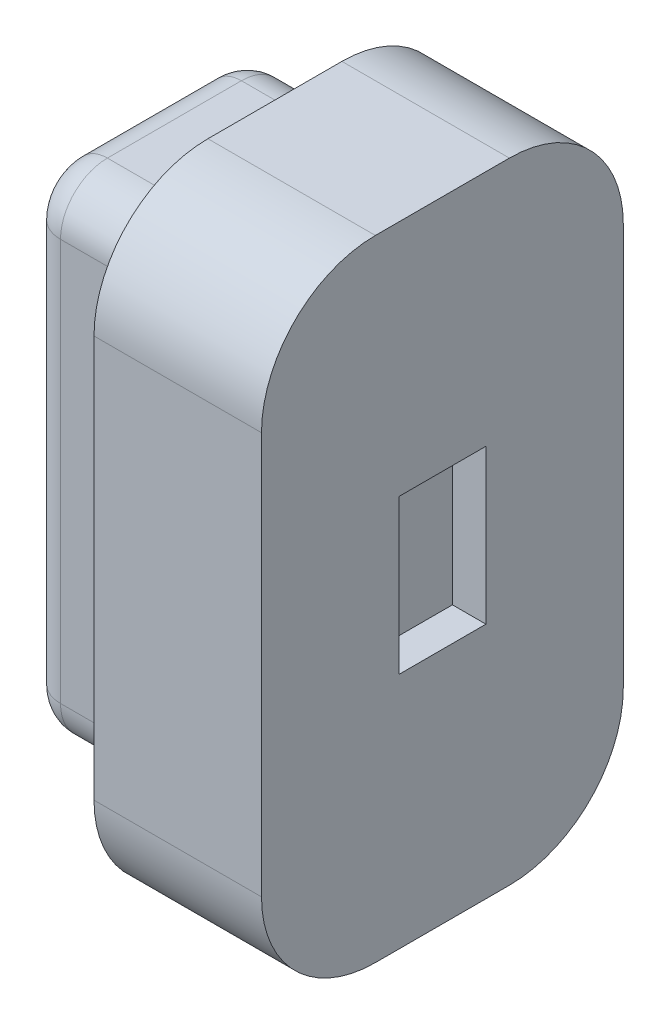
ISO-10303-21;
HEADER;
FILE_DESCRIPTION(('STEP AP214'),'2;1');
FILE_NAME('part.step','',(''),(''),'','','');
FILE_SCHEMA(('AUTOMOTIVE_DESIGN { 1 0 10303 214 1 1 1 1 }'));
ENDSEC;
DATA;
#1=APPLICATION_CONTEXT('core data for automotive mechanical design processes');
#2=APPLICATION_PROTOCOL_DEFINITION('international standard','automotive_design',2000,#1);
#3=PRODUCT_CONTEXT('',#1,'mechanical');
#4=PRODUCT('Part','Part','',(#3));
#5=PRODUCT_RELATED_PRODUCT_CATEGORY('part','',(#4));
#6=PRODUCT_DEFINITION_FORMATION('','',#4);
#7=PRODUCT_DEFINITION_CONTEXT('part definition',#1,'design');
#8=PRODUCT_DEFINITION('design','',#6,#7);
#9=PRODUCT_DEFINITION_SHAPE('','',#8);
#10=(LENGTH_UNIT() NAMED_UNIT(*) SI_UNIT(.MILLI.,.METRE.));
#11=(NAMED_UNIT(*) PLANE_ANGLE_UNIT() SI_UNIT($,.RADIAN.));
#12=(NAMED_UNIT(*) SI_UNIT($,.STERADIAN.) SOLID_ANGLE_UNIT());
#13=UNCERTAINTY_MEASURE_WITH_UNIT(LENGTH_MEASURE(1.E-05),#10,'distance_accuracy_value','');
#14=(GEOMETRIC_REPRESENTATION_CONTEXT(3) GLOBAL_UNCERTAINTY_ASSIGNED_CONTEXT((#13)) GLOBAL_UNIT_ASSIGNED_CONTEXT((#10,
#11,#12)) REPRESENTATION_CONTEXT('',''));
#15=CARTESIAN_POINT('',(0.,0.,0.));
#16=DIRECTION('',(0.,0.,1.));
#17=DIRECTION('',(1.,0.,0.));
#18=AXIS2_PLACEMENT_3D('',#15,#16,#17);
#19=CARTESIAN_POINT('',(-57.5,0.,0.));
#20=DIRECTION('',(-1.,0.,0.));
#21=DIRECTION('',(0.,0.,1.));
#22=AXIS2_PLACEMENT_3D('',#19,#20,#21);
#23=PLANE('',#22);
#24=DIRECTION('',(0.,-1.,0.));
#25=VECTOR('',#24,1.);
#26=CARTESIAN_POINT('',(-57.5,0.,6.4));
#27=LINE('',#26,#25);
#28=CARTESIAN_POINT('',(-57.5,25.08,6.4));
#29=VERTEX_POINT('',#28);
#30=CARTESIAN_POINT('',(-57.5,19.08,6.4));
#31=VERTEX_POINT('',#30);
#32=EDGE_CURVE('E363',#29,#31,#27,.T.);
#33=ORIENTED_EDGE('',*,*,#32,.T.);
#34=CARTESIAN_POINT('',(-57.5,19.08,6.6));
#35=DIRECTION('',(-1.,0.,0.));
#36=DIRECTION('',(0.,0.,1.));
#37=AXIS2_PLACEMENT_3D('',#34,#35,#36);
#38=CIRCLE('',#37,0.2);
#39=CARTESIAN_POINT('',(-57.5,18.88,6.6));
#40=VERTEX_POINT('',#39);
#41=EDGE_CURVE('E365',#31,#40,#38,.T.);
#42=ORIENTED_EDGE('',*,*,#41,.T.);
#43=DIRECTION('',(0.,0.,1.));
#44=VECTOR('',#43,1.);
#45=CARTESIAN_POINT('',(-57.5,18.88,0.));
#46=LINE('',#45,#44);
#47=CARTESIAN_POINT('',(-57.5,18.88,8.6));
#48=VERTEX_POINT('',#47);
#49=EDGE_CURVE('E333',#40,#48,#46,.T.);
#50=ORIENTED_EDGE('',*,*,#49,.T.);
#51=CARTESIAN_POINT('',(-57.5,19.08,8.6));
#52=DIRECTION('',(-1.,0.,0.));
#53=DIRECTION('',(0.,0.,1.));
#54=AXIS2_PLACEMENT_3D('',#51,#52,#53);
#55=CIRCLE('',#54,0.2);
#56=CARTESIAN_POINT('',(-57.5,19.08,8.8));
#57=VERTEX_POINT('',#56);
#58=EDGE_CURVE('E353',#48,#57,#55,.T.);
#59=ORIENTED_EDGE('',*,*,#58,.T.);
#60=DIRECTION('',(0.,1.,0.));
#61=VECTOR('',#60,1.);
#62=CARTESIAN_POINT('',(-57.5,0.,8.8));
#63=LINE('',#62,#61);
#64=CARTESIAN_POINT('',(-57.5,25.08,8.8));
#65=VERTEX_POINT('',#64);
#66=EDGE_CURVE('E355',#57,#65,#63,.T.);
#67=ORIENTED_EDGE('',*,*,#66,.T.);
#68=CARTESIAN_POINT('',(-57.5,25.08,8.6));
#69=DIRECTION('',(-1.,0.,0.));
#70=DIRECTION('',(0.,0.,1.));
#71=AXIS2_PLACEMENT_3D('',#68,#69,#70);
#72=CIRCLE('',#71,0.2);
#73=CARTESIAN_POINT('',(-57.5,25.28,8.6));
#74=VERTEX_POINT('',#73);
#75=EDGE_CURVE('E357',#65,#74,#72,.T.);
#76=ORIENTED_EDGE('',*,*,#75,.T.);
#77=DIRECTION('',(0.,0.,-1.));
#78=VECTOR('',#77,1.);
#79=CARTESIAN_POINT('',(-57.5,25.28,0.));
#80=LINE('',#79,#78);
#81=CARTESIAN_POINT('',(-57.5,25.28,6.6));
#82=VERTEX_POINT('',#81);
#83=EDGE_CURVE('E359',#74,#82,#80,.T.);
#84=ORIENTED_EDGE('',*,*,#83,.T.);
#85=CARTESIAN_POINT('',(-57.5,25.08,6.6));
#86=DIRECTION('',(-1.,0.,0.));
#87=DIRECTION('',(0.,0.,1.));
#88=AXIS2_PLACEMENT_3D('',#85,#86,#87);
#89=CIRCLE('',#88,0.2);
#90=EDGE_CURVE('E361',#82,#29,#89,.T.);
#91=ORIENTED_EDGE('',*,*,#90,.T.);
#92=EDGE_LOOP('',(#33,#42,#50,#59,#67,#76,#84,#91));
#93=FACE_BOUND('',#92,.T.);
#94=ADVANCED_FACE('F45',(#93),#23,.T.);
#95=CARTESIAN_POINT('',(-57.,19.08,8.6));
#96=DIRECTION('',(-1.,0.,0.));
#97=DIRECTION('',(0.,0.,1.));
#98=AXIS2_PLACEMENT_3D('',#95,#96,#97);
#99=DEGENERATE_TOROIDAL_SURFACE('',#98,0.2,0.5,.T.);
#100=CARTESIAN_POINT('',(-57.,19.08,8.8));
#101=DIRECTION('',(0.,-1.,0.));
#102=DIRECTION('',(0.,0.,-1.));
#103=AXIS2_PLACEMENT_3D('',#100,#101,#102);
#104=CIRCLE('',#103,0.5);
#105=CARTESIAN_POINT('',(-57.,19.08,9.3));
#106=VERTEX_POINT('',#105);
#107=EDGE_CURVE('E391',#106,#57,#104,.T.);
#108=ORIENTED_EDGE('',*,*,#107,.T.);
#109=ORIENTED_EDGE('',*,*,#58,.F.);
#110=CARTESIAN_POINT('',(-57.,18.88,8.6));
#111=DIRECTION('',(0.,0.,-1.));
#112=DIRECTION('',(-1.,0.,0.));
#113=AXIS2_PLACEMENT_3D('',#110,#111,#112);
#114=CIRCLE('',#113,0.5);
#115=CARTESIAN_POINT('',(-57.,18.38,8.6));
#116=VERTEX_POINT('',#115);
#117=EDGE_CURVE('E385',#116,#48,#114,.T.);
#118=ORIENTED_EDGE('',*,*,#117,.F.);
#119=CARTESIAN_POINT('',(-57.,19.08,8.6));
#120=DIRECTION('',(-1.,0.,0.));
#121=DIRECTION('',(0.,0.,1.));
#122=AXIS2_PLACEMENT_3D('',#119,#120,#121);
#123=CIRCLE('',#122,0.7);
#124=EDGE_CURVE('E54',#106,#116,#123,.F.);
#125=ORIENTED_EDGE('',*,*,#124,.F.);
#126=EDGE_LOOP('',(#108,#109,#118,#125));
#127=FACE_BOUND('',#126,.T.);
#128=ADVANCED_FACE('F444',(#127),#99,.T.);
#129=CARTESIAN_POINT('',(-57.,0.,8.8));
#130=DIRECTION('',(0.,1.,0.));
#131=DIRECTION('',(0.,0.,1.));
#132=AXIS2_PLACEMENT_3D('',#129,#130,#131);
#133=CYLINDRICAL_SURFACE('',#132,0.5);
#134=CARTESIAN_POINT('',(-57.,25.08,8.8));
#135=DIRECTION('',(0.,-1.,0.));
#136=DIRECTION('',(0.,0.,-1.));
#137=AXIS2_PLACEMENT_3D('',#134,#135,#136);
#138=CIRCLE('',#137,0.5);
#139=CARTESIAN_POINT('',(-57.,25.08,9.3));
#140=VERTEX_POINT('',#139);
#141=EDGE_CURVE('E396',#140,#65,#138,.T.);
#142=ORIENTED_EDGE('',*,*,#141,.T.);
#143=ORIENTED_EDGE('',*,*,#66,.F.);
#144=ORIENTED_EDGE('',*,*,#107,.F.);
#145=DIRECTION('',(0.,1.,0.));
#146=VECTOR('',#145,1.);
#147=CARTESIAN_POINT('',(-57.,0.,9.3));
#148=LINE('',#147,#146);
#149=EDGE_CURVE('E379',#140,#106,#148,.F.);
#150=ORIENTED_EDGE('',*,*,#149,.F.);
#151=EDGE_LOOP('',(#142,#143,#144,#150));
#152=FACE_BOUND('',#151,.T.);
#153=ADVANCED_FACE('F442',(#152),#133,.T.);
#154=CARTESIAN_POINT('',(-57.,25.08,8.6));
#155=DIRECTION('',(-1.,0.,0.));
#156=DIRECTION('',(0.,0.,1.));
#157=AXIS2_PLACEMENT_3D('',#154,#155,#156);
#158=DEGENERATE_TOROIDAL_SURFACE('',#157,0.2,0.5,.T.);
#159=ORIENTED_EDGE('',*,*,#141,.F.);
#160=CARTESIAN_POINT('',(-57.,25.08,8.6));
#161=DIRECTION('',(-1.,0.,0.));
#162=DIRECTION('',(0.,0.,1.));
#163=AXIS2_PLACEMENT_3D('',#160,#161,#162);
#164=CIRCLE('',#163,0.7);
#165=CARTESIAN_POINT('',(-57.,25.78,8.6));
#166=VERTEX_POINT('',#165);
#167=EDGE_CURVE('E377',#166,#140,#164,.F.);
#168=ORIENTED_EDGE('',*,*,#167,.F.);
#169=CARTESIAN_POINT('',(-57.,25.28,8.6));
#170=DIRECTION('',(0.,0.,-1.));
#171=DIRECTION('',(-1.,0.,0.));
#172=AXIS2_PLACEMENT_3D('',#169,#170,#171);
#173=CIRCLE('',#172,0.5);
#174=EDGE_CURVE('E49',#74,#166,#173,.T.);
#175=ORIENTED_EDGE('',*,*,#174,.F.);
#176=ORIENTED_EDGE('',*,*,#75,.F.);
#177=EDGE_LOOP('',(#159,#168,#175,#176));
#178=FACE_BOUND('',#177,.T.);
#179=ADVANCED_FACE('F47',(#178),#158,.T.);
#180=CARTESIAN_POINT('',(-57.,25.28,0.));
#181=DIRECTION('',(0.,0.,-1.));
#182=DIRECTION('',(-1.,0.,0.));
#183=AXIS2_PLACEMENT_3D('',#180,#181,#182);
#184=CYLINDRICAL_SURFACE('',#183,0.5);
#185=ORIENTED_EDGE('',*,*,#174,.T.);
#186=DIRECTION('',(0.,0.,-1.));
#187=VECTOR('',#186,1.);
#188=CARTESIAN_POINT('',(-57.,25.78,0.));
#189=LINE('',#188,#187);
#190=CARTESIAN_POINT('',(-57.,25.78,6.6));
#191=VERTEX_POINT('',#190);
#192=EDGE_CURVE('E375',#191,#166,#189,.F.);
#193=ORIENTED_EDGE('',*,*,#192,.F.);
#194=CARTESIAN_POINT('',(-57.,25.28,6.6));
#195=DIRECTION('',(0.,0.,-1.));
#196=DIRECTION('',(-1.,0.,0.));
#197=AXIS2_PLACEMENT_3D('',#194,#195,#196);
#198=CIRCLE('',#197,0.5);
#199=EDGE_CURVE('E394',#82,#191,#198,.T.);
#200=ORIENTED_EDGE('',*,*,#199,.F.);
#201=ORIENTED_EDGE('',*,*,#83,.F.);
#202=EDGE_LOOP('',(#185,#193,#200,#201));
#203=FACE_BOUND('',#202,.T.);
#204=ADVANCED_FACE('F407',(#203),#184,.T.);
#205=CARTESIAN_POINT('',(-57.,25.08,6.6));
#206=DIRECTION('',(-1.,0.,0.));
#207=DIRECTION('',(0.,0.,1.));
#208=AXIS2_PLACEMENT_3D('',#205,#206,#207);
#209=DEGENERATE_TOROIDAL_SURFACE('',#208,0.2,0.5,.T.);
#210=ORIENTED_EDGE('',*,*,#199,.T.);
#211=CARTESIAN_POINT('',(-57.,25.08,6.6));
#212=DIRECTION('',(-1.,0.,0.));
#213=DIRECTION('',(0.,0.,1.));
#214=AXIS2_PLACEMENT_3D('',#211,#212,#213);
#215=CIRCLE('',#214,0.7);
#216=CARTESIAN_POINT('',(-57.,25.08,5.9));
#217=VERTEX_POINT('',#216);
#218=EDGE_CURVE('E373',#217,#191,#215,.F.);
#219=ORIENTED_EDGE('',*,*,#218,.F.);
#220=CARTESIAN_POINT('',(-57.,25.08,6.4));
#221=DIRECTION('',(0.,-1.,0.));
#222=DIRECTION('',(0.,0.,-1.));
#223=AXIS2_PLACEMENT_3D('',#220,#221,#222);
#224=CIRCLE('',#223,0.5);
#225=EDGE_CURVE('E388',#29,#217,#224,.T.);
#226=ORIENTED_EDGE('',*,*,#225,.F.);
#227=ORIENTED_EDGE('',*,*,#90,.F.);
#228=EDGE_LOOP('',(#210,#219,#226,#227));
#229=FACE_BOUND('',#228,.T.);
#230=ADVANCED_FACE('F431',(#229),#209,.T.);
#231=CARTESIAN_POINT('',(-57.,0.,6.4));
#232=DIRECTION('',(0.,-1.,0.));
#233=DIRECTION('',(0.,0.,-1.));
#234=AXIS2_PLACEMENT_3D('',#231,#232,#233);
#235=CYLINDRICAL_SURFACE('',#234,0.5);
#236=ORIENTED_EDGE('',*,*,#225,.T.);
#237=DIRECTION('',(0.,-1.,0.));
#238=VECTOR('',#237,1.);
#239=CARTESIAN_POINT('',(-57.,0.,5.9));
#240=LINE('',#239,#238);
#241=CARTESIAN_POINT('',(-57.,19.08,5.9));
#242=VERTEX_POINT('',#241);
#243=EDGE_CURVE('E371',#242,#217,#240,.F.);
#244=ORIENTED_EDGE('',*,*,#243,.F.);
#245=CARTESIAN_POINT('',(-57.,19.08,6.4));
#246=DIRECTION('',(0.,-1.,0.));
#247=DIRECTION('',(0.,0.,-1.));
#248=AXIS2_PLACEMENT_3D('',#245,#246,#247);
#249=CIRCLE('',#248,0.5);
#250=EDGE_CURVE('E383',#31,#242,#249,.T.);
#251=ORIENTED_EDGE('',*,*,#250,.F.);
#252=ORIENTED_EDGE('',*,*,#32,.F.);
#253=EDGE_LOOP('',(#236,#244,#251,#252));
#254=FACE_BOUND('',#253,.T.);
#255=ADVANCED_FACE('F436',(#254),#235,.T.);
#256=CARTESIAN_POINT('',(-57.,19.08,6.6));
#257=DIRECTION('',(-1.,0.,0.));
#258=DIRECTION('',(0.,0.,1.));
#259=AXIS2_PLACEMENT_3D('',#256,#257,#258);
#260=DEGENERATE_TOROIDAL_SURFACE('',#259,0.2,0.5,.T.);
#261=ORIENTED_EDGE('',*,*,#250,.T.);
#262=CARTESIAN_POINT('',(-57.,19.08,6.6));
#263=DIRECTION('',(-1.,0.,0.));
#264=DIRECTION('',(0.,0.,1.));
#265=AXIS2_PLACEMENT_3D('',#262,#263,#264);
#266=CIRCLE('',#265,0.7);
#267=CARTESIAN_POINT('',(-57.,18.38,6.6));
#268=VERTEX_POINT('',#267);
#269=EDGE_CURVE('E368',#268,#242,#266,.F.);
#270=ORIENTED_EDGE('',*,*,#269,.F.);
#271=CARTESIAN_POINT('',(-57.,18.88,6.6));
#272=DIRECTION('',(0.,0.,-1.));
#273=DIRECTION('',(-1.,0.,0.));
#274=AXIS2_PLACEMENT_3D('',#271,#272,#273);
#275=CIRCLE('',#274,0.5);
#276=EDGE_CURVE('E243',#268,#40,#275,.T.);
#277=ORIENTED_EDGE('',*,*,#276,.T.);
#278=ORIENTED_EDGE('',*,*,#41,.F.);
#279=EDGE_LOOP('',(#261,#270,#277,#278));
#280=FACE_BOUND('',#279,.T.);
#281=ADVANCED_FACE('F459',(#280),#260,.T.);
#282=CARTESIAN_POINT('',(-57.,18.88,0.));
#283=DIRECTION('',(0.,0.,1.));
#284=DIRECTION('',(1.,0.,0.));
#285=AXIS2_PLACEMENT_3D('',#282,#283,#284);
#286=CYLINDRICAL_SURFACE('',#285,0.5);
#287=ORIENTED_EDGE('',*,*,#117,.T.);
#288=ORIENTED_EDGE('',*,*,#49,.F.);
#289=ORIENTED_EDGE('',*,*,#276,.F.);
#290=DIRECTION('',(0.,0.,1.));
#291=VECTOR('',#290,1.);
#292=CARTESIAN_POINT('',(-57.,18.38,0.));
#293=LINE('',#292,#291);
#294=EDGE_CURVE('E11',#116,#268,#293,.F.);
#295=ORIENTED_EDGE('',*,*,#294,.F.);
#296=EDGE_LOOP('',(#287,#288,#289,#295));
#297=FACE_BOUND('',#296,.T.);
#298=ADVANCED_FACE('F450',(#297),#286,.T.);
#299=CARTESIAN_POINT('',(-55.5,19.08,8.6));
#300=DIRECTION('',(-1.,0.,0.));
#301=DIRECTION('',(0.,-1.,0.));
#302=AXIS2_PLACEMENT_3D('',#299,#300,#301);
#303=CYLINDRICAL_SURFACE('',#302,0.7);
#304=DIRECTION('',(-1.,0.,0.));
#305=VECTOR('',#304,1.);
#306=CARTESIAN_POINT('',(-55.5,19.08,9.3));
#307=LINE('',#306,#305);
#308=CARTESIAN_POINT('',(-55.5,19.08,9.3));
#309=VERTEX_POINT('',#308);
#310=EDGE_CURVE('E349',#309,#106,#307,.T.);
#311=ORIENTED_EDGE('',*,*,#310,.T.);
#312=ORIENTED_EDGE('',*,*,#124,.T.);
#313=DIRECTION('',(-1.,0.,0.));
#314=VECTOR('',#313,1.);
#315=CARTESIAN_POINT('',(-55.5,18.38,8.6));
#316=LINE('',#315,#314);
#317=CARTESIAN_POINT('',(-55.5,18.38,8.6));
#318=VERTEX_POINT('',#317);
#319=EDGE_CURVE('E329',#318,#116,#316,.T.);
#320=ORIENTED_EDGE('',*,*,#319,.F.);
#321=CARTESIAN_POINT('',(-55.5,19.08,8.6));
#322=DIRECTION('',(-1.,0.,0.));
#323=DIRECTION('',(0.,0.,1.));
#324=AXIS2_PLACEMENT_3D('',#321,#322,#323);
#325=CIRCLE('',#324,0.7);
#326=EDGE_CURVE('E308',#318,#309,#325,.T.);
#327=ORIENTED_EDGE('',*,*,#326,.T.);
#328=EDGE_LOOP('',(#311,#312,#320,#327));
#329=FACE_BOUND('',#328,.T.);
#330=ADVANCED_FACE('F467',(#329),#303,.T.);
#331=CARTESIAN_POINT('',(-55.5,0.,9.3));
#332=DIRECTION('',(0.,0.,1.));
#333=DIRECTION('',(1.,0.,0.));
#334=AXIS2_PLACEMENT_3D('',#331,#332,#333);
#335=PLANE('',#334);
#336=DIRECTION('',(-1.,0.,0.));
#337=VECTOR('',#336,1.);
#338=CARTESIAN_POINT('',(-55.5,25.08,9.3));
#339=LINE('',#338,#337);
#340=CARTESIAN_POINT('',(-55.5,25.08,9.3));
#341=VERTEX_POINT('',#340);
#342=EDGE_CURVE('E346',#341,#140,#339,.T.);
#343=ORIENTED_EDGE('',*,*,#342,.T.);
#344=ORIENTED_EDGE('',*,*,#149,.T.);
#345=ORIENTED_EDGE('',*,*,#310,.F.);
#346=DIRECTION('',(0.,1.,0.));
#347=VECTOR('',#346,1.);
#348=CARTESIAN_POINT('',(-55.5,0.,9.3));
#349=LINE('',#348,#347);
#350=EDGE_CURVE('E311',#309,#341,#349,.T.);
#351=ORIENTED_EDGE('',*,*,#350,.T.);
#352=EDGE_LOOP('',(#343,#344,#345,#351));
#353=FACE_BOUND('',#352,.T.);
#354=ADVANCED_FACE('F417',(#353),#335,.T.);
#355=CARTESIAN_POINT('',(-55.5,25.08,8.6));
#356=DIRECTION('',(-1.,0.,0.));
#357=DIRECTION('',(0.,-1.,0.));
#358=AXIS2_PLACEMENT_3D('',#355,#356,#357);
#359=CYLINDRICAL_SURFACE('',#358,0.7);
#360=DIRECTION('',(-1.,0.,0.));
#361=VECTOR('',#360,1.);
#362=CARTESIAN_POINT('',(-55.5,25.78,8.6));
#363=LINE('',#362,#361);
#364=CARTESIAN_POINT('',(-55.5,25.78,8.6));
#365=VERTEX_POINT('',#364);
#366=EDGE_CURVE('E343',#365,#166,#363,.T.);
#367=ORIENTED_EDGE('',*,*,#366,.T.);
#368=ORIENTED_EDGE('',*,*,#167,.T.);
#369=ORIENTED_EDGE('',*,*,#342,.F.);
#370=CARTESIAN_POINT('',(-55.5,25.08,8.6));
#371=DIRECTION('',(-1.,0.,0.));
#372=DIRECTION('',(0.,0.,1.));
#373=AXIS2_PLACEMENT_3D('',#370,#371,#372);
#374=CIRCLE('',#373,0.7);
#375=EDGE_CURVE('E314',#341,#365,#374,.T.);
#376=ORIENTED_EDGE('',*,*,#375,.T.);
#377=EDGE_LOOP('',(#367,#368,#369,#376));
#378=FACE_BOUND('',#377,.T.);
#379=ADVANCED_FACE('F414',(#378),#359,.T.);
#380=CARTESIAN_POINT('',(-55.5,25.78,0.));
#381=DIRECTION('',(0.,1.,0.));
#382=DIRECTION('',(-1.,0.,0.));
#383=AXIS2_PLACEMENT_3D('',#380,#381,#382);
#384=PLANE('',#383);
#385=DIRECTION('',(-1.,0.,0.));
#386=VECTOR('',#385,1.);
#387=CARTESIAN_POINT('',(-55.5,25.78,6.6));
#388=LINE('',#387,#386);
#389=CARTESIAN_POINT('',(-55.5,25.78,6.6));
#390=VERTEX_POINT('',#389);
#391=EDGE_CURVE('E340',#390,#191,#388,.T.);
#392=ORIENTED_EDGE('',*,*,#391,.T.);
#393=ORIENTED_EDGE('',*,*,#192,.T.);
#394=ORIENTED_EDGE('',*,*,#366,.F.);
#395=DIRECTION('',(0.,0.,-1.));
#396=VECTOR('',#395,1.);
#397=CARTESIAN_POINT('',(-55.5,25.78,0.));
#398=LINE('',#397,#396);
#399=EDGE_CURVE('E317',#365,#390,#398,.T.);
#400=ORIENTED_EDGE('',*,*,#399,.T.);
#401=EDGE_LOOP('',(#392,#393,#394,#400));
#402=FACE_BOUND('',#401,.T.);
#403=ADVANCED_FACE('F424',(#402),#384,.T.);
#404=CARTESIAN_POINT('',(-55.5,25.08,6.6));
#405=DIRECTION('',(-1.,0.,0.));
#406=DIRECTION('',(0.,-1.,0.));
#407=AXIS2_PLACEMENT_3D('',#404,#405,#406);
#408=CYLINDRICAL_SURFACE('',#407,0.7);
#409=DIRECTION('',(-1.,0.,0.));
#410=VECTOR('',#409,1.);
#411=CARTESIAN_POINT('',(-55.5,25.08,5.9));
#412=LINE('',#411,#410);
#413=CARTESIAN_POINT('',(-55.5,25.08,5.9));
#414=VERTEX_POINT('',#413);
#415=EDGE_CURVE('E337',#414,#217,#412,.T.);
#416=ORIENTED_EDGE('',*,*,#415,.T.);
#417=ORIENTED_EDGE('',*,*,#218,.T.);
#418=ORIENTED_EDGE('',*,*,#391,.F.);
#419=CARTESIAN_POINT('',(-55.5,25.08,6.6));
#420=DIRECTION('',(-1.,0.,0.));
#421=DIRECTION('',(0.,0.,1.));
#422=AXIS2_PLACEMENT_3D('',#419,#420,#421);
#423=CIRCLE('',#422,0.7);
#424=EDGE_CURVE('E320',#390,#414,#423,.T.);
#425=ORIENTED_EDGE('',*,*,#424,.T.);
#426=EDGE_LOOP('',(#416,#417,#418,#425));
#427=FACE_BOUND('',#426,.T.);
#428=ADVANCED_FACE('F426',(#427),#408,.T.);
#429=CARTESIAN_POINT('',(-55.5,0.,5.9));
#430=DIRECTION('',(0.,0.,-1.));
#431=DIRECTION('',(0.,1.,0.));
#432=AXIS2_PLACEMENT_3D('',#429,#430,#431);
#433=PLANE('',#432);
#434=DIRECTION('',(-1.,0.,0.));
#435=VECTOR('',#434,1.);
#436=CARTESIAN_POINT('',(-55.5,19.08,5.9));
#437=LINE('',#436,#435);
#438=CARTESIAN_POINT('',(-55.5,19.08,5.9));
#439=VERTEX_POINT('',#438);
#440=EDGE_CURVE('E334',#439,#242,#437,.T.);
#441=ORIENTED_EDGE('',*,*,#440,.T.);
#442=ORIENTED_EDGE('',*,*,#243,.T.);
#443=ORIENTED_EDGE('',*,*,#415,.F.);
#444=DIRECTION('',(0.,-1.,0.));
#445=VECTOR('',#444,1.);
#446=CARTESIAN_POINT('',(-55.5,0.,5.9));
#447=LINE('',#446,#445);
#448=EDGE_CURVE('E323',#414,#439,#447,.T.);
#449=ORIENTED_EDGE('',*,*,#448,.T.);
#450=EDGE_LOOP('',(#441,#442,#443,#449));
#451=FACE_BOUND('',#450,.T.);
#452=ADVANCED_FACE('F499',(#451),#433,.T.);
#453=CARTESIAN_POINT('',(-55.5,19.08,6.6));
#454=DIRECTION('',(-1.,0.,0.));
#455=DIRECTION('',(0.,-1.,0.));
#456=AXIS2_PLACEMENT_3D('',#453,#454,#455);
#457=CYLINDRICAL_SURFACE('',#456,0.7);
#458=DIRECTION('',(-1.,0.,0.));
#459=VECTOR('',#458,1.);
#460=CARTESIAN_POINT('',(-55.5,18.38,6.6));
#461=LINE('',#460,#459);
#462=CARTESIAN_POINT('',(-55.5,18.38,6.6));
#463=VERTEX_POINT('',#462);
#464=EDGE_CURVE('E330',#463,#268,#461,.T.);
#465=ORIENTED_EDGE('',*,*,#464,.T.);
#466=ORIENTED_EDGE('',*,*,#269,.T.);
#467=ORIENTED_EDGE('',*,*,#440,.F.);
#468=CARTESIAN_POINT('',(-55.5,19.08,6.6));
#469=DIRECTION('',(-1.,0.,0.));
#470=DIRECTION('',(0.,0.,1.));
#471=AXIS2_PLACEMENT_3D('',#468,#469,#470);
#472=CIRCLE('',#471,0.7);
#473=EDGE_CURVE('E326',#439,#463,#472,.T.);
#474=ORIENTED_EDGE('',*,*,#473,.T.);
#475=EDGE_LOOP('',(#465,#466,#467,#474));
#476=FACE_BOUND('',#475,.T.);
#477=ADVANCED_FACE('F456',(#476),#457,.T.);
#478=CARTESIAN_POINT('',(-55.5,18.38,0.));
#479=DIRECTION('',(0.,-1.,0.));
#480=DIRECTION('',(1.,0.,0.));
#481=AXIS2_PLACEMENT_3D('',#478,#479,#480);
#482=PLANE('',#481);
#483=ORIENTED_EDGE('',*,*,#319,.T.);
#484=ORIENTED_EDGE('',*,*,#294,.T.);
#485=ORIENTED_EDGE('',*,*,#464,.F.);
#486=DIRECTION('',(0.,0.,1.));
#487=VECTOR('',#486,1.);
#488=CARTESIAN_POINT('',(-55.5,18.38,0.));
#489=LINE('',#488,#487);
#490=EDGE_CURVE('E305',#463,#318,#489,.T.);
#491=ORIENTED_EDGE('',*,*,#490,.T.);
#492=EDGE_LOOP('',(#483,#484,#485,#491));
#493=FACE_BOUND('',#492,.T.);
#494=ADVANCED_FACE('F453',(#493),#482,.T.);
#495=CARTESIAN_POINT('',(-53.,25.08,8.6));
#496=DIRECTION('',(-1.,0.,0.));
#497=DIRECTION('',(0.,0.,1.));
#498=AXIS2_PLACEMENT_3D('',#495,#496,#497);
#499=CYLINDRICAL_SURFACE('',#498,1.7);
#500=CARTESIAN_POINT('',(-55.5,25.08,8.6));
#501=DIRECTION('',(1.,0.,0.));
#502=DIRECTION('',(0.,0.,-1.));
#503=AXIS2_PLACEMENT_3D('',#500,#501,#502);
#504=CIRCLE('',#503,1.7);
#505=CARTESIAN_POINT('',(-55.5,26.78,8.6));
#506=VERTEX_POINT('',#505);
#507=CARTESIAN_POINT('',(-55.5,25.08,10.3));
#508=VERTEX_POINT('',#507);
#509=EDGE_CURVE('E269',#506,#508,#504,.T.);
#510=ORIENTED_EDGE('',*,*,#509,.T.);
#511=DIRECTION('',(-1.,0.,0.));
#512=VECTOR('',#511,1.);
#513=CARTESIAN_POINT('',(-53.,25.08,10.3));
#514=LINE('',#513,#512);
#515=CARTESIAN_POINT('',(-53.,25.08,10.3));
#516=VERTEX_POINT('',#515);
#517=EDGE_CURVE('E299',#516,#508,#514,.T.);
#518=ORIENTED_EDGE('',*,*,#517,.F.);
#519=CARTESIAN_POINT('',(-53.,25.08,8.6));
#520=DIRECTION('',(1.,0.,0.));
#521=DIRECTION('',(0.,0.,-1.));
#522=AXIS2_PLACEMENT_3D('',#519,#520,#521);
#523=CIRCLE('',#522,1.7);
#524=CARTESIAN_POINT('',(-53.,26.78,8.6));
#525=VERTEX_POINT('',#524);
#526=EDGE_CURVE('E250',#525,#516,#523,.T.);
#527=ORIENTED_EDGE('',*,*,#526,.F.);
#528=DIRECTION('',(-1.,0.,0.));
#529=VECTOR('',#528,1.);
#530=CARTESIAN_POINT('',(-53.,26.78,8.6));
#531=LINE('',#530,#529);
#532=EDGE_CURVE('E302',#525,#506,#531,.T.);
#533=ORIENTED_EDGE('',*,*,#532,.T.);
#534=EDGE_LOOP('',(#510,#518,#527,#533));
#535=FACE_BOUND('',#534,.T.);
#536=ADVANCED_FACE('F513',(#535),#499,.T.);
#537=CARTESIAN_POINT('',(-53.,0.,10.3));
#538=DIRECTION('',(0.,0.,-1.));
#539=DIRECTION('',(-1.,0.,0.));
#540=AXIS2_PLACEMENT_3D('',#537,#538,#539);
#541=PLANE('',#540);
#542=DIRECTION('',(0.,-1.,0.));
#543=VECTOR('',#542,1.);
#544=CARTESIAN_POINT('',(-55.5,0.,10.3));
#545=LINE('',#544,#543);
#546=CARTESIAN_POINT('',(-55.5,19.08,10.3));
#547=VERTEX_POINT('',#546);
#548=EDGE_CURVE('E271',#508,#547,#545,.T.);
#549=ORIENTED_EDGE('',*,*,#548,.T.);
#550=DIRECTION('',(-1.,0.,0.));
#551=VECTOR('',#550,1.);
#552=CARTESIAN_POINT('',(-53.,19.08,10.3));
#553=LINE('',#552,#551);
#554=CARTESIAN_POINT('',(-53.,19.08,10.3));
#555=VERTEX_POINT('',#554);
#556=EDGE_CURVE('E296',#555,#547,#553,.T.);
#557=ORIENTED_EDGE('',*,*,#556,.F.);
#558=DIRECTION('',(0.,-1.,0.));
#559=VECTOR('',#558,1.);
#560=CARTESIAN_POINT('',(-53.,0.,10.3));
#561=LINE('',#560,#559);
#562=EDGE_CURVE('E253',#516,#555,#561,.T.);
#563=ORIENTED_EDGE('',*,*,#562,.F.);
#564=ORIENTED_EDGE('',*,*,#517,.T.);
#565=EDGE_LOOP('',(#549,#557,#563,#564));
#566=FACE_BOUND('',#565,.T.);
#567=ADVANCED_FACE('F519',(#566),#541,.F.);
#568=CARTESIAN_POINT('',(-53.,19.08,8.6));
#569=DIRECTION('',(-1.,0.,0.));
#570=DIRECTION('',(0.,0.,1.));
#571=AXIS2_PLACEMENT_3D('',#568,#569,#570);
#572=CYLINDRICAL_SURFACE('',#571,1.7);
#573=CARTESIAN_POINT('',(-55.5,19.08,8.6));
#574=DIRECTION('',(1.,0.,0.));
#575=DIRECTION('',(0.,0.,-1.));
#576=AXIS2_PLACEMENT_3D('',#573,#574,#575);
#577=CIRCLE('',#576,1.7);
#578=CARTESIAN_POINT('',(-55.5,17.38,8.6));
#579=VERTEX_POINT('',#578);
#580=EDGE_CURVE('E273',#547,#579,#577,.T.);
#581=ORIENTED_EDGE('',*,*,#580,.T.);
#582=DIRECTION('',(-1.,0.,0.));
#583=VECTOR('',#582,1.);
#584=CARTESIAN_POINT('',(-53.,17.38,8.6));
#585=LINE('',#584,#583);
#586=CARTESIAN_POINT('',(-53.,17.38,8.6));
#587=VERTEX_POINT('',#586);
#588=EDGE_CURVE('E293',#587,#579,#585,.T.);
#589=ORIENTED_EDGE('',*,*,#588,.F.);
#590=CARTESIAN_POINT('',(-53.,19.08,8.6));
#591=DIRECTION('',(1.,0.,0.));
#592=DIRECTION('',(0.,0.,-1.));
#593=AXIS2_PLACEMENT_3D('',#590,#591,#592);
#594=CIRCLE('',#593,1.7);
#595=EDGE_CURVE('E255',#555,#587,#594,.T.);
#596=ORIENTED_EDGE('',*,*,#595,.F.);
#597=ORIENTED_EDGE('',*,*,#556,.T.);
#598=EDGE_LOOP('',(#581,#589,#596,#597));
#599=FACE_BOUND('',#598,.T.);
#600=ADVANCED_FACE('F525',(#599),#572,.T.);
#601=CARTESIAN_POINT('',(-53.,17.38,0.));
#602=DIRECTION('',(0.,1.,0.));
#603=DIRECTION('',(0.,0.,1.));
#604=AXIS2_PLACEMENT_3D('',#601,#602,#603);
#605=PLANE('',#604);
#606=DIRECTION('',(0.,0.,-1.));
#607=VECTOR('',#606,1.);
#608=CARTESIAN_POINT('',(-55.5,17.38,0.));
#609=LINE('',#608,#607);
#610=CARTESIAN_POINT('',(-55.5,17.38,6.6));
#611=VERTEX_POINT('',#610);
#612=EDGE_CURVE('E275',#579,#611,#609,.T.);
#613=ORIENTED_EDGE('',*,*,#612,.T.);
#614=DIRECTION('',(-1.,0.,0.));
#615=VECTOR('',#614,1.);
#616=CARTESIAN_POINT('',(-53.,17.38,6.6));
#617=LINE('',#616,#615);
#618=CARTESIAN_POINT('',(-53.,17.38,6.6));
#619=VERTEX_POINT('',#618);
#620=EDGE_CURVE('E290',#619,#611,#617,.T.);
#621=ORIENTED_EDGE('',*,*,#620,.F.);
#622=DIRECTION('',(0.,0.,-1.));
#623=VECTOR('',#622,1.);
#624=CARTESIAN_POINT('',(-53.,17.38,0.));
#625=LINE('',#624,#623);
#626=EDGE_CURVE('E257',#587,#619,#625,.T.);
#627=ORIENTED_EDGE('',*,*,#626,.F.);
#628=ORIENTED_EDGE('',*,*,#588,.T.);
#629=EDGE_LOOP('',(#613,#621,#627,#628));
#630=FACE_BOUND('',#629,.T.);
#631=ADVANCED_FACE('F531',(#630),#605,.F.);
#632=CARTESIAN_POINT('',(-53.,19.08,6.6));
#633=DIRECTION('',(-1.,0.,0.));
#634=DIRECTION('',(0.,0.,1.));
#635=AXIS2_PLACEMENT_3D('',#632,#633,#634);
#636=CYLINDRICAL_SURFACE('',#635,1.7);
#637=CARTESIAN_POINT('',(-55.5,19.08,6.6));
#638=DIRECTION('',(1.,0.,0.));
#639=DIRECTION('',(0.,0.,-1.));
#640=AXIS2_PLACEMENT_3D('',#637,#638,#639);
#641=CIRCLE('',#640,1.7);
#642=CARTESIAN_POINT('',(-55.5,19.08,4.9));
#643=VERTEX_POINT('',#642);
#644=EDGE_CURVE('E277',#611,#643,#641,.T.);
#645=ORIENTED_EDGE('',*,*,#644,.T.);
#646=DIRECTION('',(-1.,0.,0.));
#647=VECTOR('',#646,1.);
#648=CARTESIAN_POINT('',(-53.,19.08,4.9));
#649=LINE('',#648,#647);
#650=CARTESIAN_POINT('',(-53.,19.08,4.9));
#651=VERTEX_POINT('',#650);
#652=EDGE_CURVE('E287',#651,#643,#649,.T.);
#653=ORIENTED_EDGE('',*,*,#652,.F.);
#654=CARTESIAN_POINT('',(-53.,19.08,6.6));
#655=DIRECTION('',(1.,0.,0.));
#656=DIRECTION('',(0.,0.,-1.));
#657=AXIS2_PLACEMENT_3D('',#654,#655,#656);
#658=CIRCLE('',#657,1.7);
#659=EDGE_CURVE('E259',#619,#651,#658,.T.);
#660=ORIENTED_EDGE('',*,*,#659,.F.);
#661=ORIENTED_EDGE('',*,*,#620,.T.);
#662=EDGE_LOOP('',(#645,#653,#660,#661));
#663=FACE_BOUND('',#662,.T.);
#664=ADVANCED_FACE('F535',(#663),#636,.T.);
#665=CARTESIAN_POINT('',(-53.,0.,4.9));
#666=DIRECTION('',(0.,0.,1.));
#667=DIRECTION('',(1.,0.,0.));
#668=AXIS2_PLACEMENT_3D('',#665,#666,#667);
#669=PLANE('',#668);
#670=DIRECTION('',(0.,1.,0.));
#671=VECTOR('',#670,1.);
#672=CARTESIAN_POINT('',(-55.5,0.,4.9));
#673=LINE('',#672,#671);
#674=CARTESIAN_POINT('',(-55.5,25.08,4.9));
#675=VERTEX_POINT('',#674);
#676=EDGE_CURVE('E279',#643,#675,#673,.T.);
#677=ORIENTED_EDGE('',*,*,#676,.T.);
#678=DIRECTION('',(-1.,0.,0.));
#679=VECTOR('',#678,1.);
#680=CARTESIAN_POINT('',(-53.,25.08,4.9));
#681=LINE('',#680,#679);
#682=CARTESIAN_POINT('',(-53.,25.08,4.9));
#683=VERTEX_POINT('',#682);
#684=EDGE_CURVE('E284',#683,#675,#681,.T.);
#685=ORIENTED_EDGE('',*,*,#684,.F.);
#686=DIRECTION('',(0.,1.,0.));
#687=VECTOR('',#686,1.);
#688=CARTESIAN_POINT('',(-53.,0.,4.9));
#689=LINE('',#688,#687);
#690=EDGE_CURVE('E261',#651,#683,#689,.T.);
#691=ORIENTED_EDGE('',*,*,#690,.F.);
#692=ORIENTED_EDGE('',*,*,#652,.T.);
#693=EDGE_LOOP('',(#677,#685,#691,#692));
#694=FACE_BOUND('',#693,.T.);
#695=ADVANCED_FACE('F539',(#694),#669,.F.);
#696=CARTESIAN_POINT('',(-53.,26.78,0.));
#697=DIRECTION('',(0.,-1.,0.));
#698=DIRECTION('',(0.,0.,-1.));
#699=AXIS2_PLACEMENT_3D('',#696,#697,#698);
#700=PLANE('',#699);
#701=DIRECTION('',(0.,0.,1.));
#702=VECTOR('',#701,1.);
#703=CARTESIAN_POINT('',(-55.5,26.78,0.));
#704=LINE('',#703,#702);
#705=CARTESIAN_POINT('',(-55.5,26.78,6.6));
#706=VERTEX_POINT('',#705);
#707=EDGE_CURVE('E266',#706,#506,#704,.T.);
#708=ORIENTED_EDGE('',*,*,#707,.T.);
#709=ORIENTED_EDGE('',*,*,#532,.F.);
#710=DIRECTION('',(0.,0.,1.));
#711=VECTOR('',#710,1.);
#712=CARTESIAN_POINT('',(-53.,26.78,0.));
#713=LINE('',#712,#711);
#714=CARTESIAN_POINT('',(-53.,26.78,6.6));
#715=VERTEX_POINT('',#714);
#716=EDGE_CURVE('E247',#715,#525,#713,.T.);
#717=ORIENTED_EDGE('',*,*,#716,.F.);
#718=DIRECTION('',(-1.,0.,0.));
#719=VECTOR('',#718,1.);
#720=CARTESIAN_POINT('',(-53.,26.78,6.6));
#721=LINE('',#720,#719);
#722=EDGE_CURVE('E265',#715,#706,#721,.T.);
#723=ORIENTED_EDGE('',*,*,#722,.T.);
#724=EDGE_LOOP('',(#708,#709,#717,#723));
#725=FACE_BOUND('',#724,.T.);
#726=ADVANCED_FACE('F495',(#725),#700,.F.);
#727=CARTESIAN_POINT('',(-55.5,0.,0.));
#728=DIRECTION('',(1.,0.,0.));
#729=DIRECTION('',(0.,0.,-1.));
#730=AXIS2_PLACEMENT_3D('',#727,#728,#729);
#731=PLANE('',#730);
#732=ORIENTED_EDGE('',*,*,#490,.F.);
#733=ORIENTED_EDGE('',*,*,#473,.F.);
#734=ORIENTED_EDGE('',*,*,#448,.F.);
#735=ORIENTED_EDGE('',*,*,#424,.F.);
#736=ORIENTED_EDGE('',*,*,#399,.F.);
#737=ORIENTED_EDGE('',*,*,#375,.F.);
#738=ORIENTED_EDGE('',*,*,#350,.F.);
#739=ORIENTED_EDGE('',*,*,#326,.F.);
#740=EDGE_LOOP('',(#732,#733,#734,#735,#736,#737,#738,#739));
#741=FACE_BOUND('',#740,.T.);
#742=ORIENTED_EDGE('',*,*,#707,.F.);
#743=CARTESIAN_POINT('',(-55.5,25.08,6.6));
#744=DIRECTION('',(1.,0.,0.));
#745=DIRECTION('',(0.,0.,-1.));
#746=AXIS2_PLACEMENT_3D('',#743,#744,#745);
#747=CIRCLE('',#746,1.7);
#748=EDGE_CURVE('E251',#675,#706,#747,.T.);
#749=ORIENTED_EDGE('',*,*,#748,.F.);
#750=ORIENTED_EDGE('',*,*,#676,.F.);
#751=ORIENTED_EDGE('',*,*,#644,.F.);
#752=ORIENTED_EDGE('',*,*,#612,.F.);
#753=ORIENTED_EDGE('',*,*,#580,.F.);
#754=ORIENTED_EDGE('',*,*,#548,.F.);
#755=ORIENTED_EDGE('',*,*,#509,.F.);
#756=EDGE_LOOP('',(#742,#749,#750,#751,#752,#753,#754,#755));
#757=FACE_BOUND('',#756,.T.);
#758=ADVANCED_FACE('F420',(#741,#757),#731,.F.);
#759=CARTESIAN_POINT('',(-53.,25.08,6.6));
#760=DIRECTION('',(-1.,0.,0.));
#761=DIRECTION('',(0.,0.,1.));
#762=AXIS2_PLACEMENT_3D('',#759,#760,#761);
#763=CYLINDRICAL_SURFACE('',#762,1.7);
#764=ORIENTED_EDGE('',*,*,#748,.T.);
#765=ORIENTED_EDGE('',*,*,#722,.F.);
#766=CARTESIAN_POINT('',(-53.,25.08,6.6));
#767=DIRECTION('',(1.,0.,0.));
#768=DIRECTION('',(0.,0.,-1.));
#769=AXIS2_PLACEMENT_3D('',#766,#767,#768);
#770=CIRCLE('',#769,1.7);
#771=EDGE_CURVE('E263',#683,#715,#770,.T.);
#772=ORIENTED_EDGE('',*,*,#771,.F.);
#773=ORIENTED_EDGE('',*,*,#684,.T.);
#774=EDGE_LOOP('',(#764,#765,#772,#773));
#775=FACE_BOUND('',#774,.T.);
#776=ADVANCED_FACE('F473',(#775),#763,.T.);
#777=CARTESIAN_POINT('',(-53.,0.,0.));
#778=DIRECTION('',(1.,0.,0.));
#779=DIRECTION('',(0.,0.,-1.));
#780=AXIS2_PLACEMENT_3D('',#777,#778,#779);
#781=PLANE('',#780);
#782=DIRECTION('',(0.,1.,0.));
#783=VECTOR('',#782,1.);
#784=CARTESIAN_POINT('',(-53.,23.23,6.95));
#785=LINE('',#784,#783);
#786=CARTESIAN_POINT('',(-53.,20.93,6.95));
#787=VERTEX_POINT('',#786);
#788=CARTESIAN_POINT('',(-53.,23.23,6.95));
#789=VERTEX_POINT('',#788);
#790=EDGE_CURVE('E62',#787,#789,#785,.T.);
#791=ORIENTED_EDGE('',*,*,#790,.F.);
#792=DIRECTION('',(0.,0.,-1.));
#793=VECTOR('',#792,1.);
#794=CARTESIAN_POINT('',(-53.,20.93,8.25));
#795=LINE('',#794,#793);
#796=CARTESIAN_POINT('',(-53.,20.93,8.25));
#797=VERTEX_POINT('',#796);
#798=EDGE_CURVE('E228',#797,#787,#795,.T.);
#799=ORIENTED_EDGE('',*,*,#798,.F.);
#800=DIRECTION('',(0.,-1.,0.));
#801=VECTOR('',#800,1.);
#802=CARTESIAN_POINT('',(-53.,23.23,8.25));
#803=LINE('',#802,#801);
#804=CARTESIAN_POINT('',(-53.,23.23,8.25));
#805=VERTEX_POINT('',#804);
#806=EDGE_CURVE('E231',#805,#797,#803,.T.);
#807=ORIENTED_EDGE('',*,*,#806,.F.);
#808=DIRECTION('',(0.,0.,1.));
#809=VECTOR('',#808,1.);
#810=CARTESIAN_POINT('',(-53.,23.23,8.25));
#811=LINE('',#810,#809);
#812=EDGE_CURVE('E237',#789,#805,#811,.T.);
#813=ORIENTED_EDGE('',*,*,#812,.F.);
#814=EDGE_LOOP('',(#791,#799,#807,#813));
#815=FACE_BOUND('',#814,.T.);
#816=ORIENTED_EDGE('',*,*,#716,.T.);
#817=ORIENTED_EDGE('',*,*,#526,.T.);
#818=ORIENTED_EDGE('',*,*,#562,.T.);
#819=ORIENTED_EDGE('',*,*,#595,.T.);
#820=ORIENTED_EDGE('',*,*,#626,.T.);
#821=ORIENTED_EDGE('',*,*,#659,.T.);
#822=ORIENTED_EDGE('',*,*,#690,.T.);
#823=ORIENTED_EDGE('',*,*,#771,.T.);
#824=EDGE_LOOP('',(#816,#817,#818,#819,#820,#821,#822,#823));
#825=FACE_BOUND('',#824,.T.);
#826=ADVANCED_FACE('F471',(#815,#825),#781,.T.);
#827=CARTESIAN_POINT('',(-53.5,23.23,6.95));
#828=DIRECTION('',(0.,0.,-1.));
#829=DIRECTION('',(0.,1.,0.));
#830=AXIS2_PLACEMENT_3D('',#827,#828,#829);
#831=PLANE('',#830);
#832=ORIENTED_EDGE('',*,*,#790,.T.);
#833=DIRECTION('',(1.,0.,0.));
#834=VECTOR('',#833,1.);
#835=CARTESIAN_POINT('',(-53.5,23.23,6.95));
#836=LINE('',#835,#834);
#837=CARTESIAN_POINT('',(-53.5,23.23,6.95));
#838=VERTEX_POINT('',#837);
#839=EDGE_CURVE('E206',#838,#789,#836,.T.);
#840=ORIENTED_EDGE('',*,*,#839,.F.);
#841=DIRECTION('',(0.,1.,0.));
#842=VECTOR('',#841,1.);
#843=CARTESIAN_POINT('',(-53.5,23.23,6.95));
#844=LINE('',#843,#842);
#845=CARTESIAN_POINT('',(-53.5,20.93,6.95));
#846=VERTEX_POINT('',#845);
#847=EDGE_CURVE('E210',#846,#838,#844,.T.);
#848=ORIENTED_EDGE('',*,*,#847,.F.);
#849=DIRECTION('',(1.,0.,0.));
#850=VECTOR('',#849,1.);
#851=CARTESIAN_POINT('',(-53.5,20.93,6.95));
#852=LINE('',#851,#850);
#853=EDGE_CURVE('E241',#846,#787,#852,.T.);
#854=ORIENTED_EDGE('',*,*,#853,.T.);
#855=EDGE_LOOP('',(#832,#840,#848,#854));
#856=FACE_BOUND('',#855,.T.);
#857=ADVANCED_FACE('F208',(#856),#831,.F.);
#858=CARTESIAN_POINT('',(-53.5,20.93,8.25));
#859=DIRECTION('',(0.,-1.,0.));
#860=DIRECTION('',(0.,0.,-1.));
#861=AXIS2_PLACEMENT_3D('',#858,#859,#860);
#862=PLANE('',#861);
#863=ORIENTED_EDGE('',*,*,#798,.T.);
#864=ORIENTED_EDGE('',*,*,#853,.F.);
#865=DIRECTION('',(0.,0.,-1.));
#866=VECTOR('',#865,1.);
#867=CARTESIAN_POINT('',(-53.5,20.93,8.25));
#868=LINE('',#867,#866);
#869=CARTESIAN_POINT('',(-53.5,20.93,8.25));
#870=VERTEX_POINT('',#869);
#871=EDGE_CURVE('E216',#870,#846,#868,.T.);
#872=ORIENTED_EDGE('',*,*,#871,.F.);
#873=DIRECTION('',(1.,0.,0.));
#874=VECTOR('',#873,1.);
#875=CARTESIAN_POINT('',(-53.5,20.93,8.25));
#876=LINE('',#875,#874);
#877=EDGE_CURVE('E244',#870,#797,#876,.T.);
#878=ORIENTED_EDGE('',*,*,#877,.T.);
#879=EDGE_LOOP('',(#863,#864,#872,#878));
#880=FACE_BOUND('',#879,.T.);
#881=ADVANCED_FACE('F480',(#880),#862,.F.);
#882=CARTESIAN_POINT('',(-53.5,23.23,8.25));
#883=DIRECTION('',(0.,0.,1.));
#884=DIRECTION('',(1.,0.,0.));
#885=AXIS2_PLACEMENT_3D('',#882,#883,#884);
#886=PLANE('',#885);
#887=ORIENTED_EDGE('',*,*,#806,.T.);
#888=ORIENTED_EDGE('',*,*,#877,.F.);
#889=DIRECTION('',(0.,-1.,0.));
#890=VECTOR('',#889,1.);
#891=CARTESIAN_POINT('',(-53.5,23.23,8.25));
#892=LINE('',#891,#890);
#893=CARTESIAN_POINT('',(-53.5,23.23,8.25));
#894=VERTEX_POINT('',#893);
#895=EDGE_CURVE('E224',#894,#870,#892,.T.);
#896=ORIENTED_EDGE('',*,*,#895,.F.);
#897=DIRECTION('',(1.,0.,0.));
#898=VECTOR('',#897,1.);
#899=CARTESIAN_POINT('',(-53.5,23.23,8.25));
#900=LINE('',#899,#898);
#901=EDGE_CURVE('E215',#894,#805,#900,.T.);
#902=ORIENTED_EDGE('',*,*,#901,.T.);
#903=EDGE_LOOP('',(#887,#888,#896,#902));
#904=FACE_BOUND('',#903,.T.);
#905=ADVANCED_FACE('F610',(#904),#886,.F.);
#906=CARTESIAN_POINT('',(-53.5,23.23,8.25));
#907=DIRECTION('',(0.,1.,0.));
#908=DIRECTION('',(0.,0.,1.));
#909=AXIS2_PLACEMENT_3D('',#906,#907,#908);
#910=PLANE('',#909);
#911=ORIENTED_EDGE('',*,*,#812,.T.);
#912=ORIENTED_EDGE('',*,*,#901,.F.);
#913=DIRECTION('',(0.,0.,1.));
#914=VECTOR('',#913,1.);
#915=CARTESIAN_POINT('',(-53.5,23.23,8.25));
#916=LINE('',#915,#914);
#917=EDGE_CURVE('E219',#838,#894,#916,.T.);
#918=ORIENTED_EDGE('',*,*,#917,.F.);
#919=ORIENTED_EDGE('',*,*,#839,.T.);
#920=EDGE_LOOP('',(#911,#912,#918,#919));
#921=FACE_BOUND('',#920,.T.);
#922=ADVANCED_FACE('F220',(#921),#910,.F.);
#923=CARTESIAN_POINT('',(-53.5,0.,0.));
#924=DIRECTION('',(1.,0.,0.));
#925=DIRECTION('',(0.,0.,-1.));
#926=AXIS2_PLACEMENT_3D('',#923,#924,#925);
#927=PLANE('',#926);
#928=ORIENTED_EDGE('',*,*,#847,.T.);
#929=ORIENTED_EDGE('',*,*,#917,.T.);
#930=ORIENTED_EDGE('',*,*,#895,.T.);
#931=ORIENTED_EDGE('',*,*,#871,.T.);
#932=EDGE_LOOP('',(#928,#929,#930,#931));
#933=FACE_BOUND('',#932,.T.);
#934=ADVANCED_FACE('F226',(#933),#927,.T.);
#935=CLOSED_SHELL('',(#94,#128,#153,#179,#204,#230,#255,#281,#298,#330,#354,#379,#403,#428,#452,
#477,#494,#536,#567,#600,#631,#664,#695,#726,#758,#776,#826,#857,#881,#905,#922,#934));
#936=MANIFOLD_SOLID_BREP('B2',#935);
#937=ADVANCED_BREP_SHAPE_REPRESENTATION('',(#18,#936),#14);
#938=SHAPE_DEFINITION_REPRESENTATION(#9,#937);
ENDSEC;
END-ISO-10303-21;
